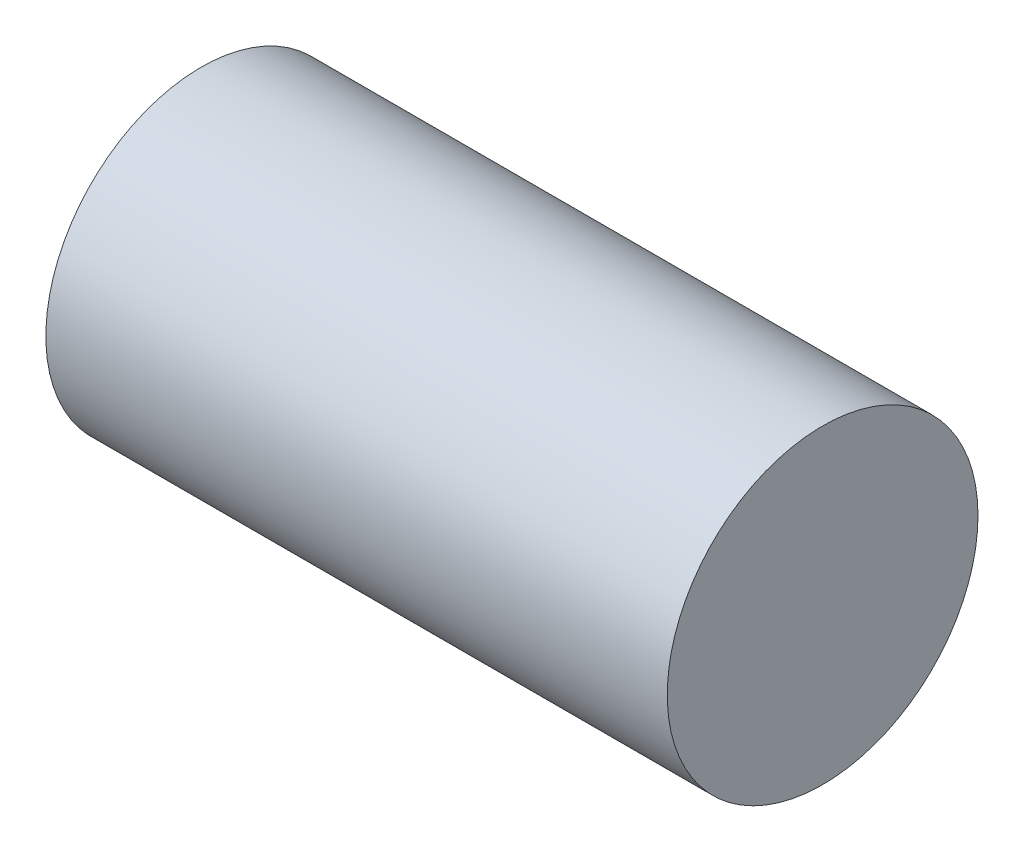
ISO-10303-21;
HEADER;
FILE_DESCRIPTION(('STEP AP214'),'2;1');
FILE_NAME('part.step','',(''),(''),'','','');
FILE_SCHEMA(('AUTOMOTIVE_DESIGN { 1 0 10303 214 1 1 1 1 }'));
ENDSEC;
DATA;
#1=APPLICATION_CONTEXT('core data for automotive mechanical design processes');
#2=APPLICATION_PROTOCOL_DEFINITION('international standard','automotive_design',2000,#1);
#3=PRODUCT_CONTEXT('',#1,'mechanical');
#4=PRODUCT('Part','Part','',(#3));
#5=PRODUCT_RELATED_PRODUCT_CATEGORY('part','',(#4));
#6=PRODUCT_DEFINITION_FORMATION('','',#4);
#7=PRODUCT_DEFINITION_CONTEXT('part definition',#1,'design');
#8=PRODUCT_DEFINITION('design','',#6,#7);
#9=PRODUCT_DEFINITION_SHAPE('','',#8);
#10=(LENGTH_UNIT() NAMED_UNIT(*) SI_UNIT(.MILLI.,.METRE.));
#11=(NAMED_UNIT(*) PLANE_ANGLE_UNIT() SI_UNIT($,.RADIAN.));
#12=(NAMED_UNIT(*) SI_UNIT($,.STERADIAN.) SOLID_ANGLE_UNIT());
#13=UNCERTAINTY_MEASURE_WITH_UNIT(LENGTH_MEASURE(1.E-05),#10,'distance_accuracy_value','');
#14=(GEOMETRIC_REPRESENTATION_CONTEXT(3) GLOBAL_UNCERTAINTY_ASSIGNED_CONTEXT((#13)) GLOBAL_UNIT_ASSIGNED_CONTEXT((#10,
#11,#12)) REPRESENTATION_CONTEXT('',''));
#15=CARTESIAN_POINT('',(0.,0.,0.));
#16=DIRECTION('',(0.,0.,1.));
#17=DIRECTION('',(1.,0.,0.));
#18=AXIS2_PLACEMENT_3D('',#15,#16,#17);
#19=CARTESIAN_POINT('',(400.,0.,0.));
#20=DIRECTION('',(-1.,0.,0.));
#21=DIRECTION('',(0.,0.,1.));
#22=AXIS2_PLACEMENT_3D('',#19,#20,#21);
#23=CYLINDRICAL_SURFACE('',#22,100.);
#24=CARTESIAN_POINT('',(400.,0.,0.));
#25=DIRECTION('',(1.,0.,0.));
#26=DIRECTION('',(0.,0.,-1.));
#27=AXIS2_PLACEMENT_3D('',#24,#25,#26);
#28=CIRCLE('',#27,100.);
#29=CARTESIAN_POINT('',(400.,0.,-100.));
#30=VERTEX_POINT('',#29);
#31=EDGE_CURVE('E10',#30,#30,#28,.T.);
#32=ORIENTED_EDGE('',*,*,#31,.F.);
#33=EDGE_LOOP('',(#32));
#34=FACE_BOUND('',#33,.T.);
#35=CARTESIAN_POINT('',(0.,0.,0.));
#36=DIRECTION('',(1.,0.,0.));
#37=DIRECTION('',(0.,0.,-1.));
#38=AXIS2_PLACEMENT_3D('',#35,#36,#37);
#39=CIRCLE('',#38,100.);
#40=CARTESIAN_POINT('',(0.,0.,-100.));
#41=VERTEX_POINT('',#40);
#42=EDGE_CURVE('E46',#41,#41,#39,.T.);
#43=ORIENTED_EDGE('',*,*,#42,.T.);
#44=EDGE_LOOP('',(#43));
#45=FACE_BOUND('',#44,.T.);
#46=ADVANCED_FACE('F43',(#34,#45),#23,.T.);
#47=CARTESIAN_POINT('',(400.,0.,0.));
#48=DIRECTION('',(1.,0.,0.));
#49=DIRECTION('',(0.,0.,-1.));
#50=AXIS2_PLACEMENT_3D('',#47,#48,#49);
#51=PLANE('',#50);
#52=ORIENTED_EDGE('',*,*,#31,.T.);
#53=EDGE_LOOP('',(#52));
#54=FACE_BOUND('',#53,.T.);
#55=ADVANCED_FACE('F60',(#54),#51,.T.);
#56=CARTESIAN_POINT('',(0.,0.,0.));
#57=DIRECTION('',(1.,0.,0.));
#58=DIRECTION('',(0.,0.,-1.));
#59=AXIS2_PLACEMENT_3D('',#56,#57,#58);
#60=PLANE('',#59);
#61=ORIENTED_EDGE('',*,*,#42,.F.);
#62=EDGE_LOOP('',(#61));
#63=FACE_BOUND('',#62,.T.);
#64=ADVANCED_FACE('F58',(#63),#60,.F.);
#65=CLOSED_SHELL('',(#46,#55,#64));
#66=MANIFOLD_SOLID_BREP('B2',#65);
#67=ADVANCED_BREP_SHAPE_REPRESENTATION('',(#18,#66),#14);
#68=SHAPE_DEFINITION_REPRESENTATION(#9,#67);
ENDSEC;
END-ISO-10303-21;
